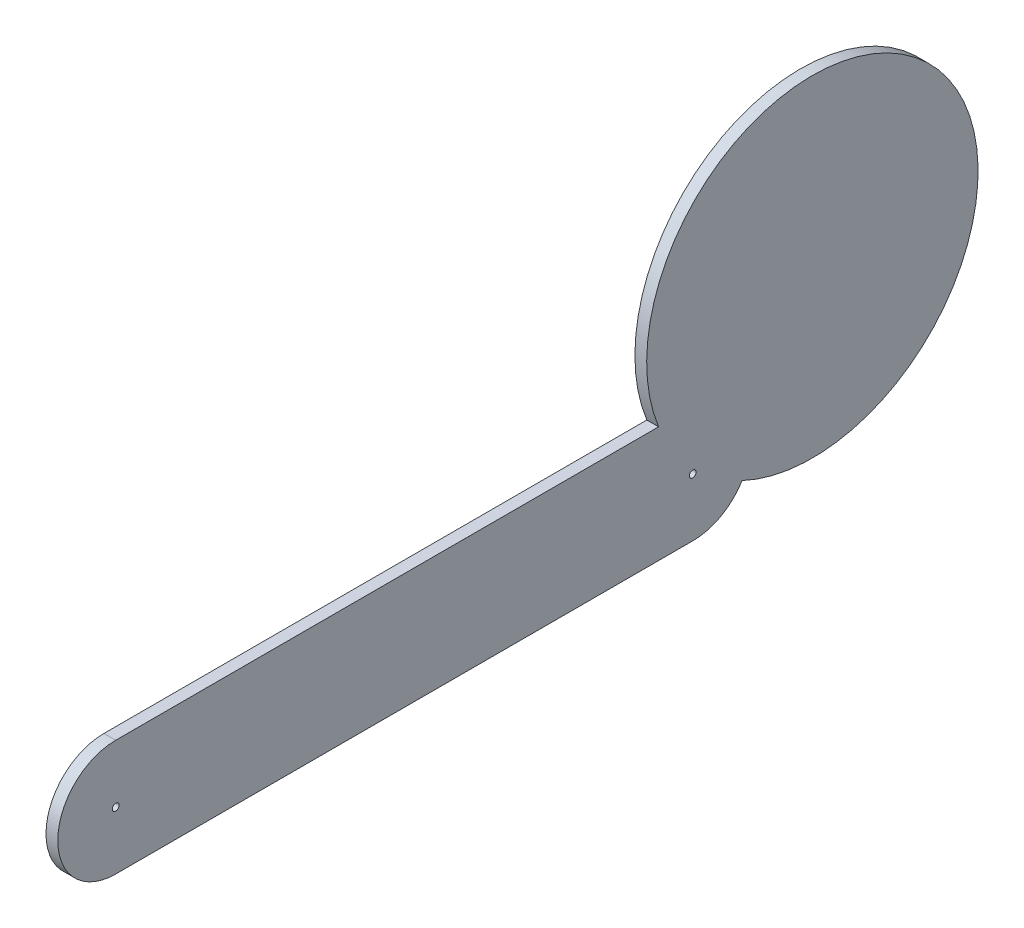
ISO-10303-21;
HEADER;
FILE_DESCRIPTION(('STEP AP214'),'2;1');
FILE_NAME('part.step','',(''),(''),'','','');
FILE_SCHEMA(('AUTOMOTIVE_DESIGN { 1 0 10303 214 1 1 1 1 }'));
ENDSEC;
DATA;
#1=APPLICATION_CONTEXT('core data for automotive mechanical design processes');
#2=APPLICATION_PROTOCOL_DEFINITION('international standard','automotive_design',2000,#1);
#3=PRODUCT_CONTEXT('',#1,'mechanical');
#4=PRODUCT('Part','Part','',(#3));
#5=PRODUCT_RELATED_PRODUCT_CATEGORY('part','',(#4));
#6=PRODUCT_DEFINITION_FORMATION('','',#4);
#7=PRODUCT_DEFINITION_CONTEXT('part definition',#1,'design');
#8=PRODUCT_DEFINITION('design','',#6,#7);
#9=PRODUCT_DEFINITION_SHAPE('','',#8);
#10=(LENGTH_UNIT() NAMED_UNIT(*) SI_UNIT(.MILLI.,.METRE.));
#11=(NAMED_UNIT(*) PLANE_ANGLE_UNIT() SI_UNIT($,.RADIAN.));
#12=(NAMED_UNIT(*) SI_UNIT($,.STERADIAN.) SOLID_ANGLE_UNIT());
#13=UNCERTAINTY_MEASURE_WITH_UNIT(LENGTH_MEASURE(1.E-05),#10,'distance_accuracy_value','');
#14=(GEOMETRIC_REPRESENTATION_CONTEXT(3) GLOBAL_UNCERTAINTY_ASSIGNED_CONTEXT((#13)) GLOBAL_UNIT_ASSIGNED_CONTEXT((#10,
#11,#12)) REPRESENTATION_CONTEXT('',''));
#15=CARTESIAN_POINT('',(0.,0.,0.));
#16=DIRECTION('',(0.,0.,1.));
#17=DIRECTION('',(1.,0.,0.));
#18=AXIS2_PLACEMENT_3D('',#15,#16,#17);
#19=CARTESIAN_POINT('',(5.08,12.2101123595505,134.851685393258));
#20=DIRECTION('',(-1.,0.,0.));
#21=DIRECTION('',(0.,0.,1.));
#22=AXIS2_PLACEMENT_3D('',#19,#20,#21);
#23=PLANE('',#22);
#24=CARTESIAN_POINT('',(5.08,12.2101123595506,-114.148314606742));
#25=DIRECTION('',(1.,0.,0.));
#26=DIRECTION('',(0.,0.,-1.));
#27=AXIS2_PLACEMENT_3D('',#24,#25,#26);
#28=CIRCLE('',#27,25.);
#29=CARTESIAN_POINT('',(5.08,-12.7898876404494,-114.148314606742));
#30=VERTEX_POINT('',#29);
#31=CARTESIAN_POINT('',(5.08,-0.91428973660003,-135.426239073629));
#32=VERTEX_POINT('',#31);
#33=EDGE_CURVE('E97',#30,#32,#28,.T.);
#34=ORIENTED_EDGE('',*,*,#33,.T.);
#35=CARTESIAN_POINT('',(5.08,63.8289073861684,-165.76710963336));
#36=DIRECTION('',(1.,0.,0.));
#37=DIRECTION('',(0.,0.,-1.));
#38=AXIS2_PLACEMENT_3D('',#35,#36,#37);
#39=CIRCLE('',#38,71.5);
#40=CARTESIAN_POINT('',(5.08,37.2101123595506,-99.4068071074451));
#41=VERTEX_POINT('',#40);
#42=EDGE_CURVE('E48',#32,#41,#39,.T.);
#43=ORIENTED_EDGE('',*,*,#42,.T.);
#44=DIRECTION('',(0.,0.,1.));
#45=VECTOR('',#44,1.);
#46=CARTESIAN_POINT('',(5.08,37.2101123595506,134.851685393258));
#47=LINE('',#46,#45);
#48=CARTESIAN_POINT('',(5.08,37.2101123595506,134.851685393258));
#49=VERTEX_POINT('',#48);
#50=EDGE_CURVE('E54',#41,#49,#47,.T.);
#51=ORIENTED_EDGE('',*,*,#50,.T.);
#52=CARTESIAN_POINT('',(5.08,12.2101123595505,134.851685393258));
#53=DIRECTION('',(1.,0.,0.));
#54=DIRECTION('',(0.,0.,1.));
#55=AXIS2_PLACEMENT_3D('',#52,#53,#54);
#56=CIRCLE('',#55,25.);
#57=CARTESIAN_POINT('',(5.08,-12.7898876404495,134.851685393258));
#58=VERTEX_POINT('',#57);
#59=EDGE_CURVE('E106',#49,#58,#56,.T.);
#60=ORIENTED_EDGE('',*,*,#59,.T.);
#61=DIRECTION('',(0.,0.,-1.));
#62=VECTOR('',#61,1.);
#63=CARTESIAN_POINT('',(5.08,-12.7898876404494,-114.148314606742));
#64=LINE('',#63,#62);
#65=EDGE_CURVE('E77',#58,#30,#64,.T.);
#66=ORIENTED_EDGE('',*,*,#65,.T.);
#67=EDGE_LOOP('',(#34,#43,#51,#60,#66));
#68=FACE_BOUND('',#67,.T.);
#69=CARTESIAN_POINT('',(5.08,12.2101123595505,134.851685393258));
#70=DIRECTION('',(1.,0.,0.));
#71=DIRECTION('',(0.,0.,-1.));
#72=AXIS2_PLACEMENT_3D('',#69,#70,#71);
#73=CIRCLE('',#72,1.4732);
#74=CARTESIAN_POINT('',(5.08,12.2101123595505,133.378485393258));
#75=VERTEX_POINT('',#74);
#76=EDGE_CURVE('E114',#75,#75,#73,.T.);
#77=ORIENTED_EDGE('',*,*,#76,.F.);
#78=EDGE_LOOP('',(#77));
#79=FACE_BOUND('',#78,.T.);
#80=CARTESIAN_POINT('',(5.08,12.2101123595506,-114.148314606742));
#81=DIRECTION('',(1.,0.,0.));
#82=DIRECTION('',(0.,0.,-1.));
#83=AXIS2_PLACEMENT_3D('',#80,#81,#82);
#84=CIRCLE('',#83,1.4732);
#85=CARTESIAN_POINT('',(5.08,12.2101123595506,-115.621514606742));
#86=VERTEX_POINT('',#85);
#87=EDGE_CURVE('E130',#86,#86,#84,.T.);
#88=ORIENTED_EDGE('',*,*,#87,.F.);
#89=EDGE_LOOP('',(#88));
#90=FACE_BOUND('',#89,.T.);
#91=ADVANCED_FACE('F33',(#68,#79,#90),#23,.F.);
#92=CARTESIAN_POINT('',(0.,12.2101123595505,134.851685393258));
#93=DIRECTION('',(-1.,0.,0.));
#94=DIRECTION('',(0.,0.,1.));
#95=AXIS2_PLACEMENT_3D('',#92,#93,#94);
#96=PLANE('',#95);
#97=DIRECTION('',(0.,0.,1.));
#98=VECTOR('',#97,1.);
#99=CARTESIAN_POINT('',(0.,37.2101123595506,134.851685393258));
#100=LINE('',#99,#98);
#101=CARTESIAN_POINT('',(0.,37.2101123595506,-99.406807107445));
#102=VERTEX_POINT('',#101);
#103=CARTESIAN_POINT('',(0.,37.2101123595506,134.851685393258));
#104=VERTEX_POINT('',#103);
#105=EDGE_CURVE('E71',#102,#104,#100,.T.);
#106=ORIENTED_EDGE('',*,*,#105,.F.);
#107=CARTESIAN_POINT('',(0.,63.8289073861684,-165.76710963336));
#108=DIRECTION('',(1.,0.,0.));
#109=DIRECTION('',(0.,0.,-1.));
#110=AXIS2_PLACEMENT_3D('',#107,#108,#109);
#111=CIRCLE('',#110,71.5);
#112=CARTESIAN_POINT('',(0.,-0.91428973660003,-135.426239073629));
#113=VERTEX_POINT('',#112);
#114=EDGE_CURVE('E90',#113,#102,#111,.T.);
#115=ORIENTED_EDGE('',*,*,#114,.F.);
#116=CARTESIAN_POINT('',(0.,12.2101123595506,-114.148314606742));
#117=DIRECTION('',(1.,0.,0.));
#118=DIRECTION('',(0.,0.,-1.));
#119=AXIS2_PLACEMENT_3D('',#116,#117,#118);
#120=CIRCLE('',#119,25.);
#121=CARTESIAN_POINT('',(0.,-12.7898876404494,-114.148314606742));
#122=VERTEX_POINT('',#121);
#123=EDGE_CURVE('E99',#122,#113,#120,.T.);
#124=ORIENTED_EDGE('',*,*,#123,.F.);
#125=DIRECTION('',(0.,0.,-1.));
#126=VECTOR('',#125,1.);
#127=CARTESIAN_POINT('',(0.,-12.7898876404494,-114.148314606742));
#128=LINE('',#127,#126);
#129=CARTESIAN_POINT('',(0.,-12.7898876404495,134.851685393258));
#130=VERTEX_POINT('',#129);
#131=EDGE_CURVE('E113',#130,#122,#128,.T.);
#132=ORIENTED_EDGE('',*,*,#131,.F.);
#133=CARTESIAN_POINT('',(0.,12.2101123595505,134.851685393258));
#134=DIRECTION('',(1.,0.,0.));
#135=DIRECTION('',(0.,0.,1.));
#136=AXIS2_PLACEMENT_3D('',#133,#134,#135);
#137=CIRCLE('',#136,25.);
#138=EDGE_CURVE('E110',#104,#130,#137,.T.);
#139=ORIENTED_EDGE('',*,*,#138,.F.);
#140=EDGE_LOOP('',(#106,#115,#124,#132,#139));
#141=FACE_BOUND('',#140,.T.);
#142=CARTESIAN_POINT('',(0.,12.2101123595505,134.851685393258));
#143=DIRECTION('',(1.,0.,0.));
#144=DIRECTION('',(0.,0.,-1.));
#145=AXIS2_PLACEMENT_3D('',#142,#143,#144);
#146=CIRCLE('',#145,1.4732);
#147=CARTESIAN_POINT('',(0.,12.2101123595505,133.378485393258));
#148=VERTEX_POINT('',#147);
#149=EDGE_CURVE('E133',#148,#148,#146,.T.);
#150=ORIENTED_EDGE('',*,*,#149,.T.);
#151=EDGE_LOOP('',(#150));
#152=FACE_BOUND('',#151,.T.);
#153=CARTESIAN_POINT('',(0.,12.2101123595506,-114.148314606742));
#154=DIRECTION('',(1.,0.,0.));
#155=DIRECTION('',(0.,0.,-1.));
#156=AXIS2_PLACEMENT_3D('',#153,#154,#155);
#157=CIRCLE('',#156,1.4732);
#158=CARTESIAN_POINT('',(0.,12.2101123595506,-115.621514606742));
#159=VERTEX_POINT('',#158);
#160=EDGE_CURVE('E100',#159,#159,#157,.T.);
#161=ORIENTED_EDGE('',*,*,#160,.T.);
#162=EDGE_LOOP('',(#161));
#163=FACE_BOUND('',#162,.T.);
#164=ADVANCED_FACE('F126',(#141,#152,#163),#96,.T.);
#165=CARTESIAN_POINT('',(5.08,12.2101123595505,134.851685393258));
#166=DIRECTION('',(-1.,0.,0.));
#167=DIRECTION('',(0.,0.,1.));
#168=AXIS2_PLACEMENT_3D('',#165,#166,#167);
#169=CYLINDRICAL_SURFACE('',#168,25.);
#170=ORIENTED_EDGE('',*,*,#138,.T.);
#171=DIRECTION('',(-1.,0.,0.));
#172=VECTOR('',#171,1.);
#173=CARTESIAN_POINT('',(5.08,-12.7898876404495,134.851685393258));
#174=LINE('',#173,#172);
#175=EDGE_CURVE('E41',#58,#130,#174,.T.);
#176=ORIENTED_EDGE('',*,*,#175,.F.);
#177=ORIENTED_EDGE('',*,*,#59,.F.);
#178=DIRECTION('',(-1.,0.,0.));
#179=VECTOR('',#178,1.);
#180=CARTESIAN_POINT('',(5.08,37.2101123595506,134.851685393258));
#181=LINE('',#180,#179);
#182=EDGE_CURVE('E104',#49,#104,#181,.T.);
#183=ORIENTED_EDGE('',*,*,#182,.T.);
#184=EDGE_LOOP('',(#170,#176,#177,#183));
#185=FACE_BOUND('',#184,.T.);
#186=ADVANCED_FACE('F35',(#185),#169,.T.);
#187=CARTESIAN_POINT('',(5.08,-12.7898876404494,-114.148314606742));
#188=DIRECTION('',(0.,1.,0.));
#189=DIRECTION('',(0.,0.,1.));
#190=AXIS2_PLACEMENT_3D('',#187,#188,#189);
#191=PLANE('',#190);
#192=ORIENTED_EDGE('',*,*,#131,.T.);
#193=DIRECTION('',(-1.,0.,0.));
#194=VECTOR('',#193,1.);
#195=CARTESIAN_POINT('',(5.08,-12.7898876404494,-114.148314606742));
#196=LINE('',#195,#194);
#197=EDGE_CURVE('E119',#30,#122,#196,.T.);
#198=ORIENTED_EDGE('',*,*,#197,.F.);
#199=ORIENTED_EDGE('',*,*,#65,.F.);
#200=ORIENTED_EDGE('',*,*,#175,.T.);
#201=EDGE_LOOP('',(#192,#198,#199,#200));
#202=FACE_BOUND('',#201,.T.);
#203=ADVANCED_FACE('F121',(#202),#191,.F.);
#204=CARTESIAN_POINT('',(5.08,12.2101123595506,-114.148314606742));
#205=DIRECTION('',(-1.,0.,0.));
#206=DIRECTION('',(0.,0.,1.));
#207=AXIS2_PLACEMENT_3D('',#204,#205,#206);
#208=CYLINDRICAL_SURFACE('',#207,25.);
#209=ORIENTED_EDGE('',*,*,#123,.T.);
#210=DIRECTION('',(1.,0.,0.));
#211=VECTOR('',#210,1.);
#212=CARTESIAN_POINT('',(2.54,-0.914289736600044,-135.426239073629));
#213=LINE('',#212,#211);
#214=EDGE_CURVE('E88',#113,#32,#213,.T.);
#215=ORIENTED_EDGE('',*,*,#214,.T.);
#216=ORIENTED_EDGE('',*,*,#33,.F.);
#217=ORIENTED_EDGE('',*,*,#197,.T.);
#218=EDGE_LOOP('',(#209,#215,#216,#217));
#219=FACE_BOUND('',#218,.T.);
#220=ADVANCED_FACE('F95',(#219),#208,.T.);
#221=CARTESIAN_POINT('',(5.08,37.2101123595506,134.851685393258));
#222=DIRECTION('',(0.,-1.,0.));
#223=DIRECTION('',(0.,0.,-1.));
#224=AXIS2_PLACEMENT_3D('',#221,#222,#223);
#225=PLANE('',#224);
#226=ORIENTED_EDGE('',*,*,#50,.F.);
#227=DIRECTION('',(1.,0.,0.));
#228=VECTOR('',#227,1.);
#229=CARTESIAN_POINT('',(0.,37.2101123595506,-99.406807107445));
#230=LINE('',#229,#228);
#231=EDGE_CURVE('E11',#41,#102,#230,.F.);
#232=ORIENTED_EDGE('',*,*,#231,.T.);
#233=ORIENTED_EDGE('',*,*,#105,.T.);
#234=ORIENTED_EDGE('',*,*,#182,.F.);
#235=EDGE_LOOP('',(#226,#232,#233,#234));
#236=FACE_BOUND('',#235,.T.);
#237=ADVANCED_FACE('F145',(#236),#225,.F.);
#238=CARTESIAN_POINT('',(5.08,12.2101123595505,134.851685393258));
#239=DIRECTION('',(-1.,0.,0.));
#240=DIRECTION('',(0.,0.,1.));
#241=AXIS2_PLACEMENT_3D('',#238,#239,#240);
#242=CYLINDRICAL_SURFACE('',#241,1.4732);
#243=ORIENTED_EDGE('',*,*,#76,.T.);
#244=EDGE_LOOP('',(#243));
#245=FACE_BOUND('',#244,.T.);
#246=ORIENTED_EDGE('',*,*,#149,.F.);
#247=EDGE_LOOP('',(#246));
#248=FACE_BOUND('',#247,.T.);
#249=ADVANCED_FACE('F142',(#245,#248),#242,.F.);
#250=CARTESIAN_POINT('',(5.08,12.2101123595506,-114.148314606742));
#251=DIRECTION('',(-1.,0.,0.));
#252=DIRECTION('',(0.,0.,1.));
#253=AXIS2_PLACEMENT_3D('',#250,#251,#252);
#254=CYLINDRICAL_SURFACE('',#253,1.4732);
#255=ORIENTED_EDGE('',*,*,#87,.T.);
#256=EDGE_LOOP('',(#255));
#257=FACE_BOUND('',#256,.T.);
#258=ORIENTED_EDGE('',*,*,#160,.F.);
#259=EDGE_LOOP('',(#258));
#260=FACE_BOUND('',#259,.T.);
#261=ADVANCED_FACE('F144',(#257,#260),#254,.F.);
#262=CARTESIAN_POINT('',(0.,63.8289073861684,-165.76710963336));
#263=DIRECTION('',(1.,0.,0.));
#264=DIRECTION('',(0.,0.,-1.));
#265=AXIS2_PLACEMENT_3D('',#262,#263,#264);
#266=CYLINDRICAL_SURFACE('',#265,71.5);
#267=ORIENTED_EDGE('',*,*,#214,.F.);
#268=ORIENTED_EDGE('',*,*,#114,.T.);
#269=ORIENTED_EDGE('',*,*,#231,.F.);
#270=ORIENTED_EDGE('',*,*,#42,.F.);
#271=EDGE_LOOP('',(#267,#268,#269,#270));
#272=FACE_BOUND('',#271,.T.);
#273=ADVANCED_FACE('F87',(#272),#266,.T.);
#274=CLOSED_SHELL('',(#91,#164,#186,#203,#220,#237,#249,#261,#273));
#275=MANIFOLD_SOLID_BREP('B2',#274);
#276=ADVANCED_BREP_SHAPE_REPRESENTATION('',(#18,#275),#14);
#277=SHAPE_DEFINITION_REPRESENTATION(#9,#276);
ENDSEC;
END-ISO-10303-21;
